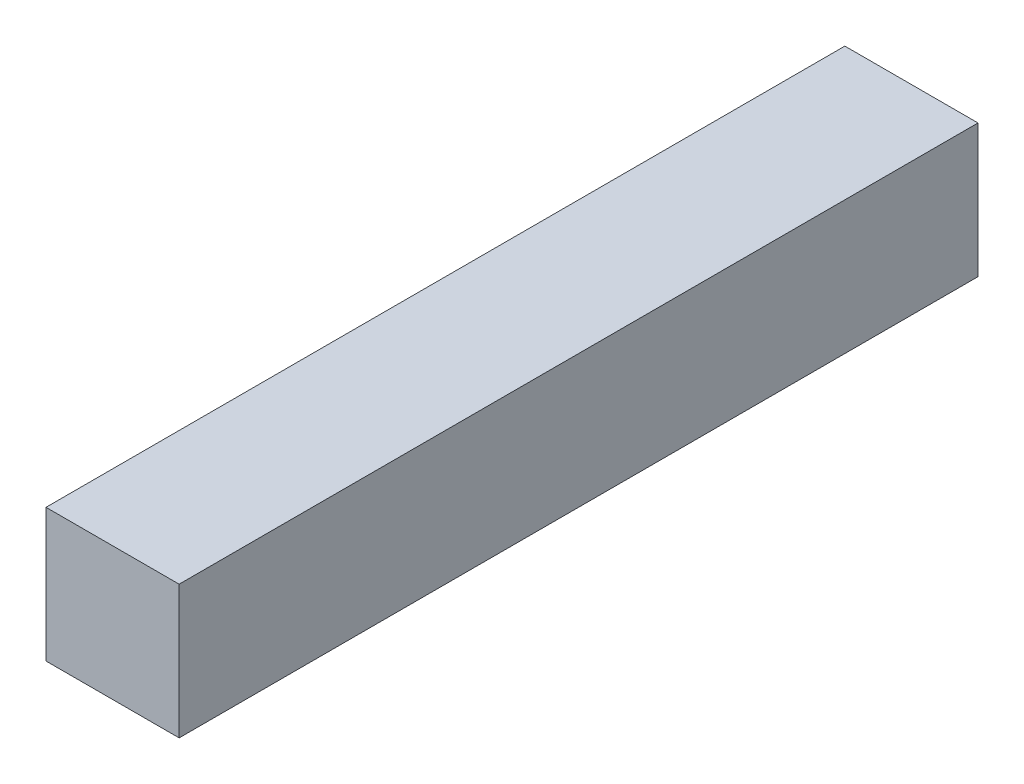
ISO-10303-21;
HEADER;
FILE_DESCRIPTION(('STEP AP214'),'2;1');
FILE_NAME('part.step','',(''),(''),'','','');
FILE_SCHEMA(('AUTOMOTIVE_DESIGN { 1 0 10303 214 1 1 1 1 }'));
ENDSEC;
DATA;
#1=APPLICATION_CONTEXT('core data for automotive mechanical design processes');
#2=APPLICATION_PROTOCOL_DEFINITION('international standard','automotive_design',2000,#1);
#3=PRODUCT_CONTEXT('',#1,'mechanical');
#4=PRODUCT('Part','Part','',(#3));
#5=PRODUCT_RELATED_PRODUCT_CATEGORY('part','',(#4));
#6=PRODUCT_DEFINITION_FORMATION('','',#4);
#7=PRODUCT_DEFINITION_CONTEXT('part definition',#1,'design');
#8=PRODUCT_DEFINITION('design','',#6,#7);
#9=PRODUCT_DEFINITION_SHAPE('','',#8);
#10=(LENGTH_UNIT() NAMED_UNIT(*) SI_UNIT(.MILLI.,.METRE.));
#11=(NAMED_UNIT(*) PLANE_ANGLE_UNIT() SI_UNIT($,.RADIAN.));
#12=(NAMED_UNIT(*) SI_UNIT($,.STERADIAN.) SOLID_ANGLE_UNIT());
#13=UNCERTAINTY_MEASURE_WITH_UNIT(LENGTH_MEASURE(1.E-05),#10,'distance_accuracy_value','');
#14=(GEOMETRIC_REPRESENTATION_CONTEXT(3) GLOBAL_UNCERTAINTY_ASSIGNED_CONTEXT((#13)) GLOBAL_UNIT_ASSIGNED_CONTEXT((#10,
#11,#12)) REPRESENTATION_CONTEXT('',''));
#15=CARTESIAN_POINT('',(0.,0.,0.));
#16=DIRECTION('',(0.,0.,1.));
#17=DIRECTION('',(1.,0.,0.));
#18=AXIS2_PLACEMENT_3D('',#15,#16,#17);
#19=CARTESIAN_POINT('',(1.5,-1.5,18.));
#20=DIRECTION('',(-1.,0.,0.));
#21=DIRECTION('',(0.,0.,1.));
#22=AXIS2_PLACEMENT_3D('',#19,#20,#21);
#23=PLANE('',#22);
#24=DIRECTION('',(0.,1.,0.));
#25=VECTOR('',#24,1.);
#26=CARTESIAN_POINT('',(1.5,-1.5,0.));
#27=LINE('',#26,#25);
#28=CARTESIAN_POINT('',(1.5,-1.5,0.));
#29=VERTEX_POINT('',#28);
#30=CARTESIAN_POINT('',(1.5,1.5,0.));
#31=VERTEX_POINT('',#30);
#32=EDGE_CURVE('E102',#29,#31,#27,.T.);
#33=ORIENTED_EDGE('',*,*,#32,.T.);
#34=DIRECTION('',(0.,0.,-1.));
#35=VECTOR('',#34,1.);
#36=CARTESIAN_POINT('',(1.5,1.5,18.));
#37=LINE('',#36,#35);
#38=CARTESIAN_POINT('',(1.5,1.5,18.));
#39=VERTEX_POINT('',#38);
#40=EDGE_CURVE('E11',#39,#31,#37,.T.);
#41=ORIENTED_EDGE('',*,*,#40,.F.);
#42=DIRECTION('',(0.,1.,0.));
#43=VECTOR('',#42,1.);
#44=CARTESIAN_POINT('',(1.5,-1.5,18.));
#45=LINE('',#44,#43);
#46=CARTESIAN_POINT('',(1.5,-1.5,18.));
#47=VERTEX_POINT('',#46);
#48=EDGE_CURVE('E90',#47,#39,#45,.T.);
#49=ORIENTED_EDGE('',*,*,#48,.F.);
#50=DIRECTION('',(0.,0.,-1.));
#51=VECTOR('',#50,1.);
#52=CARTESIAN_POINT('',(1.5,-1.5,18.));
#53=LINE('',#52,#51);
#54=EDGE_CURVE('E98',#47,#29,#53,.T.);
#55=ORIENTED_EDGE('',*,*,#54,.T.);
#56=EDGE_LOOP('',(#33,#41,#49,#55));
#57=FACE_BOUND('',#56,.T.);
#58=ADVANCED_FACE('F39',(#57),#23,.F.);
#59=CARTESIAN_POINT('',(-1.5,1.5,18.));
#60=DIRECTION('',(0.,-1.,0.));
#61=DIRECTION('',(0.,0.,-1.));
#62=AXIS2_PLACEMENT_3D('',#59,#60,#61);
#63=PLANE('',#62);
#64=DIRECTION('',(-1.,0.,0.));
#65=VECTOR('',#64,1.);
#66=CARTESIAN_POINT('',(-1.5,1.5,0.));
#67=LINE('',#66,#65);
#68=CARTESIAN_POINT('',(-1.5,1.5,0.));
#69=VERTEX_POINT('',#68);
#70=EDGE_CURVE('E94',#31,#69,#67,.T.);
#71=ORIENTED_EDGE('',*,*,#70,.T.);
#72=DIRECTION('',(0.,0.,-1.));
#73=VECTOR('',#72,1.);
#74=CARTESIAN_POINT('',(-1.5,1.5,18.));
#75=LINE('',#74,#73);
#76=CARTESIAN_POINT('',(-1.5,1.5,18.));
#77=VERTEX_POINT('',#76);
#78=EDGE_CURVE('E47',#77,#69,#75,.T.);
#79=ORIENTED_EDGE('',*,*,#78,.F.);
#80=DIRECTION('',(-1.,0.,0.));
#81=VECTOR('',#80,1.);
#82=CARTESIAN_POINT('',(-1.5,1.5,18.));
#83=LINE('',#82,#81);
#84=EDGE_CURVE('E85',#39,#77,#83,.T.);
#85=ORIENTED_EDGE('',*,*,#84,.F.);
#86=ORIENTED_EDGE('',*,*,#40,.T.);
#87=EDGE_LOOP('',(#71,#79,#85,#86));
#88=FACE_BOUND('',#87,.T.);
#89=ADVANCED_FACE('F93',(#88),#63,.F.);
#90=CARTESIAN_POINT('',(-1.5,-1.5,18.));
#91=DIRECTION('',(1.,0.,0.));
#92=DIRECTION('',(0.,0.,-1.));
#93=AXIS2_PLACEMENT_3D('',#90,#91,#92);
#94=PLANE('',#93);
#95=DIRECTION('',(0.,-1.,0.));
#96=VECTOR('',#95,1.);
#97=CARTESIAN_POINT('',(-1.5,-1.5,0.));
#98=LINE('',#97,#96);
#99=CARTESIAN_POINT('',(-1.5,-1.5,0.));
#100=VERTEX_POINT('',#99);
#101=EDGE_CURVE('E72',#69,#100,#98,.T.);
#102=ORIENTED_EDGE('',*,*,#101,.T.);
#103=DIRECTION('',(0.,0.,-1.));
#104=VECTOR('',#103,1.);
#105=CARTESIAN_POINT('',(-1.5,-1.5,18.));
#106=LINE('',#105,#104);
#107=CARTESIAN_POINT('',(-1.5,-1.5,18.));
#108=VERTEX_POINT('',#107);
#109=EDGE_CURVE('E95',#108,#100,#106,.T.);
#110=ORIENTED_EDGE('',*,*,#109,.F.);
#111=DIRECTION('',(0.,-1.,0.));
#112=VECTOR('',#111,1.);
#113=CARTESIAN_POINT('',(-1.5,-1.5,18.));
#114=LINE('',#113,#112);
#115=EDGE_CURVE('E88',#77,#108,#114,.T.);
#116=ORIENTED_EDGE('',*,*,#115,.F.);
#117=ORIENTED_EDGE('',*,*,#78,.T.);
#118=EDGE_LOOP('',(#102,#110,#116,#117));
#119=FACE_BOUND('',#118,.T.);
#120=ADVANCED_FACE('F96',(#119),#94,.F.);
#121=CARTESIAN_POINT('',(-1.5,-1.5,18.));
#122=DIRECTION('',(0.,1.,0.));
#123=DIRECTION('',(0.,0.,1.));
#124=AXIS2_PLACEMENT_3D('',#121,#122,#123);
#125=PLANE('',#124);
#126=DIRECTION('',(1.,0.,0.));
#127=VECTOR('',#126,1.);
#128=CARTESIAN_POINT('',(-1.5,-1.5,0.));
#129=LINE('',#128,#127);
#130=EDGE_CURVE('E78',#100,#29,#129,.T.);
#131=ORIENTED_EDGE('',*,*,#130,.T.);
#132=ORIENTED_EDGE('',*,*,#54,.F.);
#133=DIRECTION('',(1.,0.,0.));
#134=VECTOR('',#133,1.);
#135=CARTESIAN_POINT('',(-1.5,-1.5,18.));
#136=LINE('',#135,#134);
#137=EDGE_CURVE('E55',#108,#47,#136,.T.);
#138=ORIENTED_EDGE('',*,*,#137,.F.);
#139=ORIENTED_EDGE('',*,*,#109,.T.);
#140=EDGE_LOOP('',(#131,#132,#138,#139));
#141=FACE_BOUND('',#140,.T.);
#142=ADVANCED_FACE('F109',(#141),#125,.F.);
#143=CARTESIAN_POINT('',(0.,0.,18.));
#144=DIRECTION('',(0.,0.,-1.));
#145=DIRECTION('',(-1.,0.,0.));
#146=AXIS2_PLACEMENT_3D('',#143,#144,#145);
#147=PLANE('',#146);
#148=ORIENTED_EDGE('',*,*,#48,.T.);
#149=ORIENTED_EDGE('',*,*,#84,.T.);
#150=ORIENTED_EDGE('',*,*,#115,.T.);
#151=ORIENTED_EDGE('',*,*,#137,.T.);
#152=EDGE_LOOP('',(#148,#149,#150,#151));
#153=FACE_BOUND('',#152,.T.);
#154=ADVANCED_FACE('F86',(#153),#147,.F.);
#155=CARTESIAN_POINT('',(0.,0.,0.));
#156=DIRECTION('',(0.,0.,-1.));
#157=DIRECTION('',(-1.,0.,0.));
#158=AXIS2_PLACEMENT_3D('',#155,#156,#157);
#159=PLANE('',#158);
#160=ORIENTED_EDGE('',*,*,#32,.F.);
#161=ORIENTED_EDGE('',*,*,#130,.F.);
#162=ORIENTED_EDGE('',*,*,#101,.F.);
#163=ORIENTED_EDGE('',*,*,#70,.F.);
#164=EDGE_LOOP('',(#160,#161,#162,#163));
#165=FACE_BOUND('',#164,.T.);
#166=ADVANCED_FACE('F112',(#165),#159,.T.);
#167=CLOSED_SHELL('',(#58,#89,#120,#142,#154,#166));
#168=MANIFOLD_SOLID_BREP('B2',#167);
#169=ADVANCED_BREP_SHAPE_REPRESENTATION('',(#18,#168),#14);
#170=SHAPE_DEFINITION_REPRESENTATION(#9,#169);
ENDSEC;
END-ISO-10303-21;
